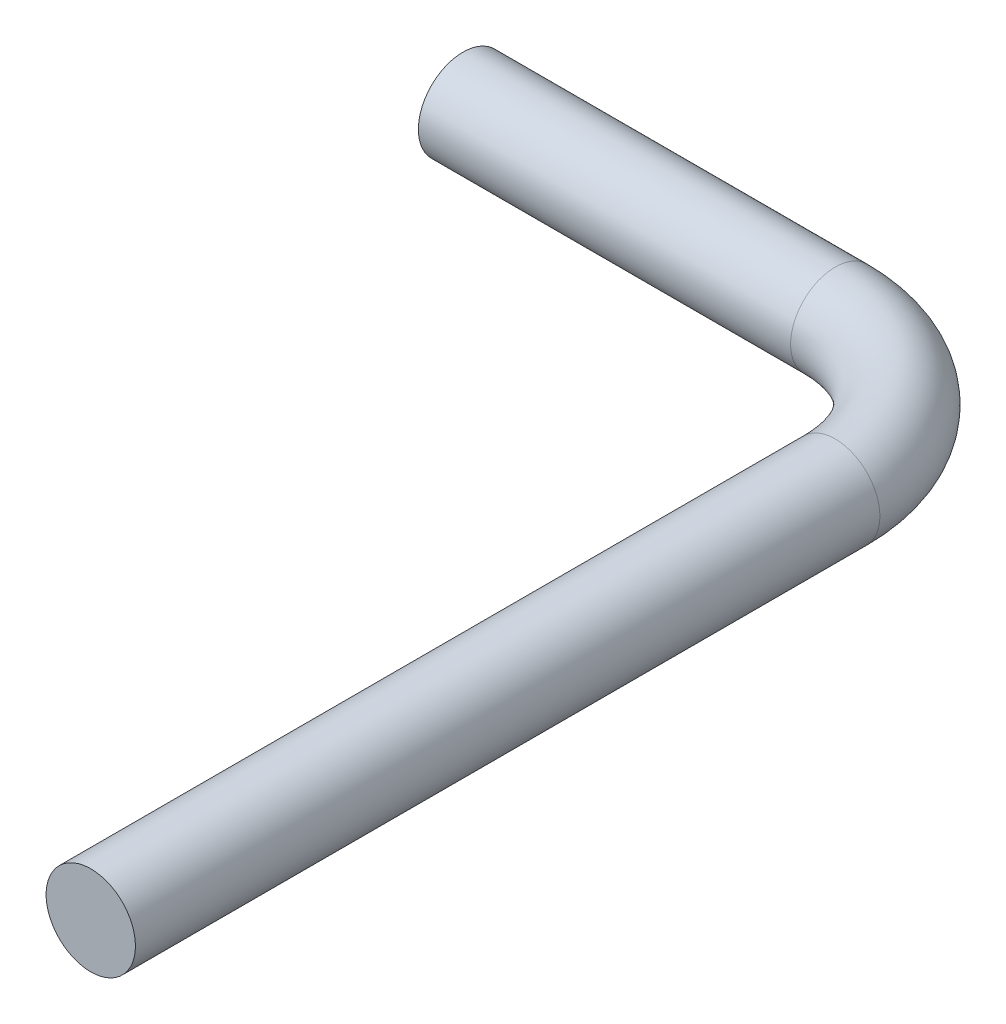
ISO-10303-21;
HEADER;
FILE_DESCRIPTION(('STEP AP214'),'2;1');
FILE_NAME('part.step','',(''),(''),'','','');
FILE_SCHEMA(('AUTOMOTIVE_DESIGN { 1 0 10303 214 1 1 1 1 }'));
ENDSEC;
DATA;
#1=APPLICATION_CONTEXT('core data for automotive mechanical design processes');
#2=APPLICATION_PROTOCOL_DEFINITION('international standard','automotive_design',2000,#1);
#3=PRODUCT_CONTEXT('',#1,'mechanical');
#4=PRODUCT('Part','Part','',(#3));
#5=PRODUCT_RELATED_PRODUCT_CATEGORY('part','',(#4));
#6=PRODUCT_DEFINITION_FORMATION('','',#4);
#7=PRODUCT_DEFINITION_CONTEXT('part definition',#1,'design');
#8=PRODUCT_DEFINITION('design','',#6,#7);
#9=PRODUCT_DEFINITION_SHAPE('','',#8);
#10=(LENGTH_UNIT() NAMED_UNIT(*) SI_UNIT(.MILLI.,.METRE.));
#11=(NAMED_UNIT(*) PLANE_ANGLE_UNIT() SI_UNIT($,.RADIAN.));
#12=(NAMED_UNIT(*) SI_UNIT($,.STERADIAN.) SOLID_ANGLE_UNIT());
#13=UNCERTAINTY_MEASURE_WITH_UNIT(LENGTH_MEASURE(1.E-05),#10,'distance_accuracy_value','');
#14=(GEOMETRIC_REPRESENTATION_CONTEXT(3) GLOBAL_UNCERTAINTY_ASSIGNED_CONTEXT((#13)) GLOBAL_UNIT_ASSIGNED_CONTEXT((#10,
#11,#12)) REPRESENTATION_CONTEXT('',''));
#15=CARTESIAN_POINT('',(0.,0.,0.));
#16=DIRECTION('',(0.,0.,1.));
#17=DIRECTION('',(1.,0.,0.));
#18=AXIS2_PLACEMENT_3D('',#15,#16,#17);
#19=CARTESIAN_POINT('',(0.,0.,0.));
#20=DIRECTION('',(1.,0.,0.));
#21=DIRECTION('',(0.,0.,-1.));
#22=AXIS2_PLACEMENT_3D('',#19,#20,#21);
#23=PLANE('',#22);
#24=CARTESIAN_POINT('',(0.,0.,0.));
#25=DIRECTION('',(1.,0.,0.));
#26=DIRECTION('',(0.,0.,-1.));
#27=AXIS2_PLACEMENT_3D('',#24,#25,#26);
#28=CIRCLE('',#27,0.3);
#29=CARTESIAN_POINT('',(0.,0.,-0.3));
#30=VERTEX_POINT('',#29);
#31=EDGE_CURVE('E47',#30,#30,#28,.T.);
#32=ORIENTED_EDGE('',*,*,#31,.F.);
#33=EDGE_LOOP('',(#32));
#34=FACE_BOUND('',#33,.T.);
#35=ADVANCED_FACE('F33',(#34),#23,.F.);
#36=CARTESIAN_POINT('',(3.5,0.,6.));
#37=DIRECTION('',(0.,0.,1.));
#38=DIRECTION('',(1.,0.,0.));
#39=AXIS2_PLACEMENT_3D('',#36,#37,#38);
#40=PLANE('',#39);
#41=CARTESIAN_POINT('',(3.5,0.,6.));
#42=DIRECTION('',(0.,0.,1.));
#43=DIRECTION('',(1.,0.,0.));
#44=AXIS2_PLACEMENT_3D('',#41,#42,#43);
#45=CIRCLE('',#44,0.3);
#46=CARTESIAN_POINT('',(3.8,0.,6.));
#47=VERTEX_POINT('',#46);
#48=EDGE_CURVE('E10',#47,#47,#45,.T.);
#49=ORIENTED_EDGE('',*,*,#48,.T.);
#50=EDGE_LOOP('',(#49));
#51=FACE_BOUND('',#50,.T.);
#52=ADVANCED_FACE('F56',(#51),#40,.T.);
#53=CARTESIAN_POINT('',(0.,0.,0.));
#54=DIRECTION('',(1.,0.,0.));
#55=DIRECTION('',(0.,0.,-1.));
#56=AXIS2_PLACEMENT_3D('',#53,#54,#55);
#57=CYLINDRICAL_SURFACE('',#56,0.3);
#58=CARTESIAN_POINT('',(2.5,0.,0.));
#59=DIRECTION('',(1.,0.,0.));
#60=DIRECTION('',(0.,0.,-1.));
#61=AXIS2_PLACEMENT_3D('',#58,#59,#60);
#62=CIRCLE('',#61,0.3);
#63=CARTESIAN_POINT('',(2.5,0.,-0.3));
#64=VERTEX_POINT('',#63);
#65=EDGE_CURVE('E43',#64,#64,#62,.T.);
#66=ORIENTED_EDGE('',*,*,#65,.F.);
#67=EDGE_LOOP('',(#66));
#68=FACE_BOUND('',#67,.T.);
#69=ORIENTED_EDGE('',*,*,#31,.T.);
#70=EDGE_LOOP('',(#69));
#71=FACE_BOUND('',#70,.T.);
#72=ADVANCED_FACE('F53',(#68,#71),#57,.T.);
#73=CARTESIAN_POINT('',(2.5,0.,1.));
#74=DIRECTION('',(0.,-1.,0.));
#75=DIRECTION('',(0.,0.,-1.));
#76=AXIS2_PLACEMENT_3D('',#73,#74,#75);
#77=TOROIDAL_SURFACE('',#76,1.,0.3);
#78=CARTESIAN_POINT('',(3.5,0.,1.));
#79=DIRECTION('',(0.,0.,1.));
#80=DIRECTION('',(1.,0.,0.));
#81=AXIS2_PLACEMENT_3D('',#78,#79,#80);
#82=CIRCLE('',#81,0.3);
#83=CARTESIAN_POINT('',(3.8,0.,1.));
#84=VERTEX_POINT('',#83);
#85=EDGE_CURVE('E39',#84,#84,#82,.T.);
#86=CARTESIAN_POINT('',(2.5,0.,1.));
#87=DIRECTION('',(0.,-1.,0.));
#88=DIRECTION('',(0.,0.,-1.));
#89=AXIS2_PLACEMENT_3D('',#86,#87,#88);
#90=CIRCLE('',#89,1.3);
#91=EDGE_CURVE('',#64,#84,#90,.T.);
#92=ORIENTED_EDGE('',*,*,#65,.T.);
#93=ORIENTED_EDGE('',*,*,#85,.F.);
#94=ORIENTED_EDGE('',*,*,#91,.T.);
#95=ORIENTED_EDGE('',*,*,#91,.F.);
#96=EDGE_LOOP('',(#92,#94,#93,#95));
#97=FACE_BOUND('',#96,.T.);
#98=ADVANCED_FACE('F62',(#97),#77,.T.);
#99=CARTESIAN_POINT('',(3.5,0.,1.));
#100=DIRECTION('',(0.,0.,1.));
#101=DIRECTION('',(1.,0.,0.));
#102=AXIS2_PLACEMENT_3D('',#99,#100,#101);
#103=CYLINDRICAL_SURFACE('',#102,0.3);
#104=ORIENTED_EDGE('',*,*,#48,.F.);
#105=EDGE_LOOP('',(#104));
#106=FACE_BOUND('',#105,.T.);
#107=ORIENTED_EDGE('',*,*,#85,.T.);
#108=EDGE_LOOP('',(#107));
#109=FACE_BOUND('',#108,.T.);
#110=ADVANCED_FACE('F60',(#106,#109),#103,.T.);
#111=CLOSED_SHELL('',(#35,#52,#72,#98,#110));
#112=MANIFOLD_SOLID_BREP('B2',#111);
#113=ADVANCED_BREP_SHAPE_REPRESENTATION('',(#18,#112),#14);
#114=SHAPE_DEFINITION_REPRESENTATION(#9,#113);
ENDSEC;
END-ISO-10303-21;
